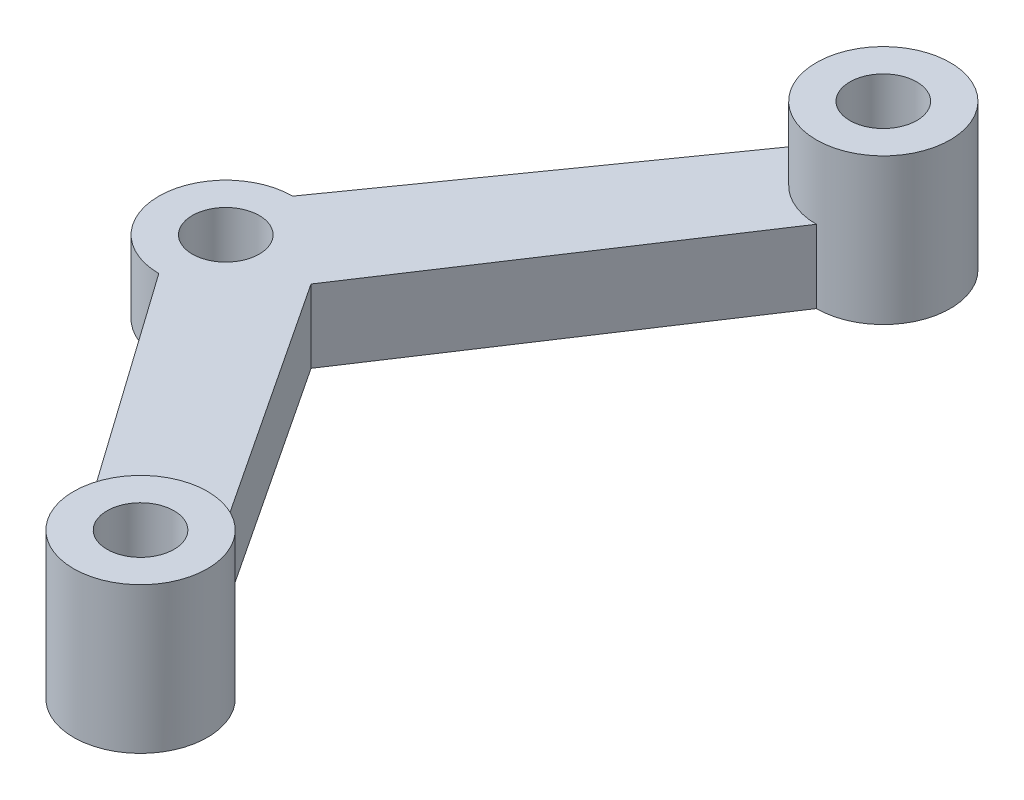
ISO-10303-21;
HEADER;
FILE_DESCRIPTION(('STEP AP214'),'2;1');
FILE_NAME('part.step','',(''),(''),'','','');
FILE_SCHEMA(('AUTOMOTIVE_DESIGN { 1 0 10303 214 1 1 1 1 }'));
ENDSEC;
DATA;
#1=APPLICATION_CONTEXT('core data for automotive mechanical design processes');
#2=APPLICATION_PROTOCOL_DEFINITION('international standard','automotive_design',2000,#1);
#3=PRODUCT_CONTEXT('',#1,'mechanical');
#4=PRODUCT('Part','Part','',(#3));
#5=PRODUCT_RELATED_PRODUCT_CATEGORY('part','',(#4));
#6=PRODUCT_DEFINITION_FORMATION('','',#4);
#7=PRODUCT_DEFINITION_CONTEXT('part definition',#1,'design');
#8=PRODUCT_DEFINITION('design','',#6,#7);
#9=PRODUCT_DEFINITION_SHAPE('','',#8);
#10=(LENGTH_UNIT() NAMED_UNIT(*) SI_UNIT(.MILLI.,.METRE.));
#11=(NAMED_UNIT(*) PLANE_ANGLE_UNIT() SI_UNIT($,.RADIAN.));
#12=(NAMED_UNIT(*) SI_UNIT($,.STERADIAN.) SOLID_ANGLE_UNIT());
#13=UNCERTAINTY_MEASURE_WITH_UNIT(LENGTH_MEASURE(1.E-05),#10,'distance_accuracy_value','');
#14=(GEOMETRIC_REPRESENTATION_CONTEXT(3) GLOBAL_UNCERTAINTY_ASSIGNED_CONTEXT((#13)) GLOBAL_UNIT_ASSIGNED_CONTEXT((#10,
#11,#12)) REPRESENTATION_CONTEXT('',''));
#15=CARTESIAN_POINT('',(0.,0.,0.));
#16=DIRECTION('',(0.,0.,1.));
#17=DIRECTION('',(1.,0.,0.));
#18=AXIS2_PLACEMENT_3D('',#15,#16,#17);
#19=CARTESIAN_POINT('',(-15.25,3.,15.25));
#20=DIRECTION('',(0.,1.,0.));
#21=DIRECTION('',(0.,0.,1.));
#22=AXIS2_PLACEMENT_3D('',#19,#20,#21);
#23=PLANE('',#22);
#24=CARTESIAN_POINT('',(-15.25,3.,-15.25));
#25=DIRECTION('',(0.,1.,0.));
#26=DIRECTION('',(0.,0.,1.));
#27=AXIS2_PLACEMENT_3D('',#24,#25,#26);
#28=CIRCLE('',#27,2.75);
#29=CARTESIAN_POINT('',(-17.9877734334544,3.,-15.5090301663348));
#30=VERTEX_POINT('',#29);
#31=CARTESIAN_POINT('',(-15.25,3.,-12.5));
#32=VERTEX_POINT('',#31);
#33=EDGE_CURVE('E11',#30,#32,#28,.T.);
#34=ORIENTED_EDGE('',*,*,#33,.F.);
#35=DIRECTION('',(-0.57693322372587,0.,0.8167913168988));
#36=VECTOR('',#35,1.);
#37=CARTESIAN_POINT('',(-17.9877734334544,3.,-15.5090301663348));
#38=LINE('',#37,#36);
#39=CARTESIAN_POINT('',(-27.,3.,-2.75));
#40=VERTEX_POINT('',#39);
#41=EDGE_CURVE('E107',#30,#40,#38,.T.);
#42=ORIENTED_EDGE('',*,*,#41,.T.);
#43=CARTESIAN_POINT('',(-27.,3.,0.));
#44=DIRECTION('',(0.,1.,0.));
#45=DIRECTION('',(0.,0.,1.));
#46=AXIS2_PLACEMENT_3D('',#43,#44,#45);
#47=CIRCLE('',#46,2.75);
#48=CARTESIAN_POINT('',(-27.,3.,2.75));
#49=VERTEX_POINT('',#48);
#50=EDGE_CURVE('E111',#40,#49,#47,.T.);
#51=ORIENTED_EDGE('',*,*,#50,.T.);
#52=DIRECTION('',(0.57693322372587,0.,0.8167913168988));
#53=VECTOR('',#52,1.);
#54=CARTESIAN_POINT('',(-27.,3.,2.75));
#55=LINE('',#54,#53);
#56=CARTESIAN_POINT('',(-17.9877734334544,3.,15.5090301663348));
#57=VERTEX_POINT('',#56);
#58=EDGE_CURVE('E59',#49,#57,#55,.T.);
#59=ORIENTED_EDGE('',*,*,#58,.T.);
#60=CARTESIAN_POINT('',(-15.25,3.,15.25));
#61=DIRECTION('',(0.,1.,0.));
#62=DIRECTION('',(0.,0.,1.));
#63=AXIS2_PLACEMENT_3D('',#60,#61,#62);
#64=CIRCLE('',#63,2.75);
#65=CARTESIAN_POINT('',(-15.25,3.,12.5));
#66=VERTEX_POINT('',#65);
#67=EDGE_CURVE('E187',#66,#57,#64,.T.);
#68=ORIENTED_EDGE('',*,*,#67,.F.);
#69=DIRECTION('',(-0.550842208330739,0.,-0.834609406561725));
#70=VECTOR('',#69,1.);
#71=CARTESIAN_POINT('',(-15.25,3.,12.5));
#72=LINE('',#71,#70);
#73=CARTESIAN_POINT('',(-23.5,3.,0.));
#74=VERTEX_POINT('',#73);
#75=EDGE_CURVE('E99',#66,#74,#72,.T.);
#76=ORIENTED_EDGE('',*,*,#75,.T.);
#77=DIRECTION('',(0.550842208330739,0.,-0.834609406561725));
#78=VECTOR('',#77,1.);
#79=CARTESIAN_POINT('',(-15.25,3.,-12.5));
#80=LINE('',#79,#78);
#81=EDGE_CURVE('E115',#74,#32,#80,.T.);
#82=ORIENTED_EDGE('',*,*,#81,.T.);
#83=EDGE_LOOP('',(#34,#42,#51,#59,#68,#76,#82));
#84=FACE_BOUND('',#83,.T.);
#85=CARTESIAN_POINT('',(-27.,3.,0.));
#86=DIRECTION('',(0.,1.,0.));
#87=DIRECTION('',(0.,0.,1.));
#88=AXIS2_PLACEMENT_3D('',#85,#86,#87);
#89=CIRCLE('',#88,1.375);
#90=CARTESIAN_POINT('',(-27.,3.,1.375));
#91=VERTEX_POINT('',#90);
#92=EDGE_CURVE('E194',#91,#91,#89,.T.);
#93=ORIENTED_EDGE('',*,*,#92,.F.);
#94=EDGE_LOOP('',(#93));
#95=FACE_BOUND('',#94,.T.);
#96=ADVANCED_FACE('F41',(#84,#95),#23,.T.);
#97=CARTESIAN_POINT('',(-15.25,0.,15.25));
#98=DIRECTION('',(0.,1.,0.));
#99=DIRECTION('',(0.,0.,1.));
#100=AXIS2_PLACEMENT_3D('',#97,#98,#99);
#101=PLANE('',#100);
#102=CARTESIAN_POINT('',(-15.25,0.,15.25));
#103=DIRECTION('',(0.,1.,0.));
#104=DIRECTION('',(0.,0.,1.));
#105=AXIS2_PLACEMENT_3D('',#102,#103,#104);
#106=CIRCLE('',#105,2.75);
#107=CARTESIAN_POINT('',(-17.9877734334544,0.,15.5090301663348));
#108=VERTEX_POINT('',#107);
#109=CARTESIAN_POINT('',(-15.25,0.,12.5));
#110=VERTEX_POINT('',#109);
#111=EDGE_CURVE('E130',#108,#110,#106,.T.);
#112=ORIENTED_EDGE('',*,*,#111,.F.);
#113=DIRECTION('',(0.57693322372587,0.,0.8167913168988));
#114=VECTOR('',#113,1.);
#115=CARTESIAN_POINT('',(-27.,0.,2.75));
#116=LINE('',#115,#114);
#117=CARTESIAN_POINT('',(-27.,0.,2.75));
#118=VERTEX_POINT('',#117);
#119=EDGE_CURVE('E92',#118,#108,#116,.T.);
#120=ORIENTED_EDGE('',*,*,#119,.F.);
#121=CARTESIAN_POINT('',(-27.,0.,0.));
#122=DIRECTION('',(0.,1.,0.));
#123=DIRECTION('',(0.,0.,1.));
#124=AXIS2_PLACEMENT_3D('',#121,#122,#123);
#125=CIRCLE('',#124,2.75);
#126=CARTESIAN_POINT('',(-27.,0.,-2.75));
#127=VERTEX_POINT('',#126);
#128=EDGE_CURVE('E86',#127,#118,#125,.T.);
#129=ORIENTED_EDGE('',*,*,#128,.F.);
#130=DIRECTION('',(-0.57693322372587,0.,0.8167913168988));
#131=VECTOR('',#130,1.);
#132=CARTESIAN_POINT('',(-17.9877734334544,0.,-15.5090301663348));
#133=LINE('',#132,#131);
#134=CARTESIAN_POINT('',(-17.9877734334544,0.,-15.5090301663348));
#135=VERTEX_POINT('',#134);
#136=EDGE_CURVE('E120',#135,#127,#133,.T.);
#137=ORIENTED_EDGE('',*,*,#136,.F.);
#138=CARTESIAN_POINT('',(-15.25,0.,-15.25));
#139=DIRECTION('',(0.,1.,0.));
#140=DIRECTION('',(0.,0.,1.));
#141=AXIS2_PLACEMENT_3D('',#138,#139,#140);
#142=CIRCLE('',#141,2.75);
#143=CARTESIAN_POINT('',(-15.25,0.,-12.5));
#144=VERTEX_POINT('',#143);
#145=EDGE_CURVE('E138',#144,#135,#142,.T.);
#146=ORIENTED_EDGE('',*,*,#145,.F.);
#147=DIRECTION('',(0.550842208330739,0.,-0.834609406561725));
#148=VECTOR('',#147,1.);
#149=CARTESIAN_POINT('',(-15.25,0.,-12.5));
#150=LINE('',#149,#148);
#151=CARTESIAN_POINT('',(-23.5,0.,0.));
#152=VERTEX_POINT('',#151);
#153=EDGE_CURVE('E136',#152,#144,#150,.T.);
#154=ORIENTED_EDGE('',*,*,#153,.F.);
#155=DIRECTION('',(-0.550842208330739,0.,-0.834609406561725));
#156=VECTOR('',#155,1.);
#157=CARTESIAN_POINT('',(-15.25,0.,12.5));
#158=LINE('',#157,#156);
#159=EDGE_CURVE('E133',#110,#152,#158,.T.);
#160=ORIENTED_EDGE('',*,*,#159,.F.);
#161=EDGE_LOOP('',(#112,#120,#129,#137,#146,#154,#160));
#162=FACE_BOUND('',#161,.T.);
#163=CARTESIAN_POINT('',(-15.25,0.,-15.25));
#164=DIRECTION('',(0.,1.,0.));
#165=DIRECTION('',(0.,0.,1.));
#166=AXIS2_PLACEMENT_3D('',#163,#164,#165);
#167=CIRCLE('',#166,1.375);
#168=CARTESIAN_POINT('',(-15.25,0.,-13.875));
#169=VERTEX_POINT('',#168);
#170=EDGE_CURVE('E134',#169,#169,#167,.T.);
#171=ORIENTED_EDGE('',*,*,#170,.T.);
#172=EDGE_LOOP('',(#171));
#173=FACE_BOUND('',#172,.T.);
#174=CARTESIAN_POINT('',(-27.,0.,0.));
#175=DIRECTION('',(0.,1.,0.));
#176=DIRECTION('',(0.,0.,1.));
#177=AXIS2_PLACEMENT_3D('',#174,#175,#176);
#178=CIRCLE('',#177,1.375);
#179=CARTESIAN_POINT('',(-27.,0.,1.375));
#180=VERTEX_POINT('',#179);
#181=EDGE_CURVE('E181',#180,#180,#178,.T.);
#182=ORIENTED_EDGE('',*,*,#181,.T.);
#183=EDGE_LOOP('',(#182));
#184=FACE_BOUND('',#183,.T.);
#185=CARTESIAN_POINT('',(-15.25,0.,15.25));
#186=DIRECTION('',(0.,1.,0.));
#187=DIRECTION('',(0.,0.,1.));
#188=AXIS2_PLACEMENT_3D('',#185,#186,#187);
#189=CIRCLE('',#188,1.375);
#190=CARTESIAN_POINT('',(-15.25,0.,16.625));
#191=VERTEX_POINT('',#190);
#192=EDGE_CURVE('E177',#191,#191,#189,.T.);
#193=ORIENTED_EDGE('',*,*,#192,.T.);
#194=EDGE_LOOP('',(#193));
#195=FACE_BOUND('',#194,.T.);
#196=ADVANCED_FACE('F163',(#162,#173,#184,#195),#101,.F.);
#197=CARTESIAN_POINT('',(-15.25,3.,15.25));
#198=DIRECTION('',(0.,-1.,0.));
#199=DIRECTION('',(0.,0.,-1.));
#200=AXIS2_PLACEMENT_3D('',#197,#198,#199);
#201=CYLINDRICAL_SURFACE('',#200,2.75);
#202=ORIENTED_EDGE('',*,*,#111,.T.);
#203=DIRECTION('',(0.,-1.,0.));
#204=VECTOR('',#203,1.);
#205=CARTESIAN_POINT('',(-15.25,3.,12.5));
#206=LINE('',#205,#204);
#207=EDGE_CURVE('E45',#66,#110,#206,.T.);
#208=ORIENTED_EDGE('',*,*,#207,.F.);
#209=ORIENTED_EDGE('',*,*,#67,.T.);
#210=DIRECTION('',(0.,-1.,0.));
#211=VECTOR('',#210,1.);
#212=CARTESIAN_POINT('',(-17.9877734334544,3.,15.5090301663348));
#213=LINE('',#212,#211);
#214=EDGE_CURVE('E126',#57,#108,#213,.T.);
#215=ORIENTED_EDGE('',*,*,#214,.T.);
#216=EDGE_LOOP('',(#202,#208,#209,#215));
#217=FACE_BOUND('',#216,.T.);
#218=CARTESIAN_POINT('',(-15.25,6.,15.25));
#219=DIRECTION('',(0.,1.,0.));
#220=DIRECTION('',(0.,0.,1.));
#221=AXIS2_PLACEMENT_3D('',#218,#219,#220);
#222=CIRCLE('',#221,2.75);
#223=CARTESIAN_POINT('',(-15.25,6.,18.));
#224=VERTEX_POINT('',#223);
#225=EDGE_CURVE('E189',#224,#224,#222,.T.);
#226=ORIENTED_EDGE('',*,*,#225,.F.);
#227=EDGE_LOOP('',(#226));
#228=FACE_BOUND('',#227,.T.);
#229=ADVANCED_FACE('F43',(#217,#228),#201,.T.);
#230=CARTESIAN_POINT('',(-15.25,3.,12.5));
#231=DIRECTION('',(-0.834609406561725,0.,0.550842208330739));
#232=DIRECTION('',(0.550842208330739,0.,0.834609406561725));
#233=AXIS2_PLACEMENT_3D('',#230,#231,#232);
#234=PLANE('',#233);
#235=ORIENTED_EDGE('',*,*,#159,.T.);
#236=DIRECTION('',(0.,-1.,0.));
#237=VECTOR('',#236,1.);
#238=CARTESIAN_POINT('',(-23.5,3.,0.));
#239=LINE('',#238,#237);
#240=EDGE_CURVE('E148',#74,#152,#239,.T.);
#241=ORIENTED_EDGE('',*,*,#240,.F.);
#242=ORIENTED_EDGE('',*,*,#75,.F.);
#243=ORIENTED_EDGE('',*,*,#207,.T.);
#244=EDGE_LOOP('',(#235,#241,#242,#243));
#245=FACE_BOUND('',#244,.T.);
#246=ADVANCED_FACE('F156',(#245),#234,.F.);
#247=CARTESIAN_POINT('',(-15.25,3.,-12.5));
#248=DIRECTION('',(-0.834609406561725,0.,-0.550842208330739));
#249=DIRECTION('',(-0.550842208330739,0.,0.834609406561725));
#250=AXIS2_PLACEMENT_3D('',#247,#248,#249);
#251=PLANE('',#250);
#252=ORIENTED_EDGE('',*,*,#153,.T.);
#253=DIRECTION('',(0.,-1.,0.));
#254=VECTOR('',#253,1.);
#255=CARTESIAN_POINT('',(-15.25,3.,-12.5));
#256=LINE('',#255,#254);
#257=EDGE_CURVE('E146',#32,#144,#256,.T.);
#258=ORIENTED_EDGE('',*,*,#257,.F.);
#259=ORIENTED_EDGE('',*,*,#81,.F.);
#260=ORIENTED_EDGE('',*,*,#240,.T.);
#261=EDGE_LOOP('',(#252,#258,#259,#260));
#262=FACE_BOUND('',#261,.T.);
#263=ADVANCED_FACE('F167',(#262),#251,.F.);
#264=CARTESIAN_POINT('',(-15.25,3.,-15.25));
#265=DIRECTION('',(0.,-1.,0.));
#266=DIRECTION('',(0.,0.,-1.));
#267=AXIS2_PLACEMENT_3D('',#264,#265,#266);
#268=CYLINDRICAL_SURFACE('',#267,2.75);
#269=ORIENTED_EDGE('',*,*,#145,.T.);
#270=DIRECTION('',(0.,-1.,0.));
#271=VECTOR('',#270,1.);
#272=CARTESIAN_POINT('',(-17.9877734334544,3.,-15.5090301663348));
#273=LINE('',#272,#271);
#274=EDGE_CURVE('E121',#30,#135,#273,.T.);
#275=ORIENTED_EDGE('',*,*,#274,.F.);
#276=ORIENTED_EDGE('',*,*,#33,.T.);
#277=ORIENTED_EDGE('',*,*,#257,.T.);
#278=EDGE_LOOP('',(#269,#275,#276,#277));
#279=FACE_BOUND('',#278,.T.);
#280=CARTESIAN_POINT('',(-15.25,6.,-15.25));
#281=DIRECTION('',(0.,1.,0.));
#282=DIRECTION('',(0.,0.,1.));
#283=AXIS2_PLACEMENT_3D('',#280,#281,#282);
#284=CIRCLE('',#283,2.75);
#285=CARTESIAN_POINT('',(-15.25,6.,-12.5));
#286=VERTEX_POINT('',#285);
#287=EDGE_CURVE('E175',#286,#286,#284,.T.);
#288=ORIENTED_EDGE('',*,*,#287,.F.);
#289=EDGE_LOOP('',(#288));
#290=FACE_BOUND('',#289,.T.);
#291=ADVANCED_FACE('F169',(#279,#290),#268,.T.);
#292=CARTESIAN_POINT('',(-17.9877734334544,3.,-15.5090301663348));
#293=DIRECTION('',(0.8167913168988,0.,0.57693322372587));
#294=DIRECTION('',(0.57693322372587,0.,-0.8167913168988));
#295=AXIS2_PLACEMENT_3D('',#292,#293,#294);
#296=PLANE('',#295);
#297=ORIENTED_EDGE('',*,*,#136,.T.);
#298=DIRECTION('',(0.,-1.,0.));
#299=VECTOR('',#298,1.);
#300=CARTESIAN_POINT('',(-27.,3.,-2.75));
#301=LINE('',#300,#299);
#302=EDGE_CURVE('E117',#40,#127,#301,.T.);
#303=ORIENTED_EDGE('',*,*,#302,.F.);
#304=ORIENTED_EDGE('',*,*,#41,.F.);
#305=ORIENTED_EDGE('',*,*,#274,.T.);
#306=EDGE_LOOP('',(#297,#303,#304,#305));
#307=FACE_BOUND('',#306,.T.);
#308=ADVANCED_FACE('F118',(#307),#296,.F.);
#309=CARTESIAN_POINT('',(-27.,3.,0.));
#310=DIRECTION('',(0.,-1.,0.));
#311=DIRECTION('',(0.,0.,-1.));
#312=AXIS2_PLACEMENT_3D('',#309,#310,#311);
#313=CYLINDRICAL_SURFACE('',#312,2.75);
#314=ORIENTED_EDGE('',*,*,#128,.T.);
#315=DIRECTION('',(0.,-1.,0.));
#316=VECTOR('',#315,1.);
#317=CARTESIAN_POINT('',(-27.,3.,2.75));
#318=LINE('',#317,#316);
#319=EDGE_CURVE('E122',#49,#118,#318,.T.);
#320=ORIENTED_EDGE('',*,*,#319,.F.);
#321=ORIENTED_EDGE('',*,*,#50,.F.);
#322=ORIENTED_EDGE('',*,*,#302,.T.);
#323=EDGE_LOOP('',(#314,#320,#321,#322));
#324=FACE_BOUND('',#323,.T.);
#325=ADVANCED_FACE('F124',(#324),#313,.T.);
#326=CARTESIAN_POINT('',(-27.,3.,2.75));
#327=DIRECTION('',(0.8167913168988,0.,-0.57693322372587));
#328=DIRECTION('',(-0.57693322372587,0.,-0.8167913168988));
#329=AXIS2_PLACEMENT_3D('',#326,#327,#328);
#330=PLANE('',#329);
#331=ORIENTED_EDGE('',*,*,#119,.T.);
#332=ORIENTED_EDGE('',*,*,#214,.F.);
#333=ORIENTED_EDGE('',*,*,#58,.F.);
#334=ORIENTED_EDGE('',*,*,#319,.T.);
#335=EDGE_LOOP('',(#331,#332,#333,#334));
#336=FACE_BOUND('',#335,.T.);
#337=ADVANCED_FACE('F208',(#336),#330,.F.);
#338=CARTESIAN_POINT('',(-15.25,3.,-15.25));
#339=DIRECTION('',(0.,-1.,0.));
#340=DIRECTION('',(0.,0.,-1.));
#341=AXIS2_PLACEMENT_3D('',#338,#339,#340);
#342=CYLINDRICAL_SURFACE('',#341,1.375);
#343=ORIENTED_EDGE('',*,*,#170,.F.);
#344=EDGE_LOOP('',(#343));
#345=FACE_BOUND('',#344,.T.);
#346=CARTESIAN_POINT('',(-15.25,6.,-15.25));
#347=DIRECTION('',(0.,1.,0.));
#348=DIRECTION('',(0.,0.,1.));
#349=AXIS2_PLACEMENT_3D('',#346,#347,#348);
#350=CIRCLE('',#349,1.375);
#351=CARTESIAN_POINT('',(-15.25,6.,-13.875));
#352=VERTEX_POINT('',#351);
#353=EDGE_CURVE('E178',#352,#352,#350,.T.);
#354=ORIENTED_EDGE('',*,*,#353,.T.);
#355=EDGE_LOOP('',(#354));
#356=FACE_BOUND('',#355,.T.);
#357=ADVANCED_FACE('F204',(#345,#356),#342,.F.);
#358=CARTESIAN_POINT('',(-27.,3.,0.));
#359=DIRECTION('',(0.,-1.,0.));
#360=DIRECTION('',(0.,0.,-1.));
#361=AXIS2_PLACEMENT_3D('',#358,#359,#360);
#362=CYLINDRICAL_SURFACE('',#361,1.375);
#363=ORIENTED_EDGE('',*,*,#92,.T.);
#364=EDGE_LOOP('',(#363));
#365=FACE_BOUND('',#364,.T.);
#366=ORIENTED_EDGE('',*,*,#181,.F.);
#367=EDGE_LOOP('',(#366));
#368=FACE_BOUND('',#367,.T.);
#369=ADVANCED_FACE('F207',(#365,#368),#362,.F.);
#370=CARTESIAN_POINT('',(-15.25,3.,15.25));
#371=DIRECTION('',(0.,-1.,0.));
#372=DIRECTION('',(0.,0.,-1.));
#373=AXIS2_PLACEMENT_3D('',#370,#371,#372);
#374=CYLINDRICAL_SURFACE('',#373,1.375);
#375=ORIENTED_EDGE('',*,*,#192,.F.);
#376=EDGE_LOOP('',(#375));
#377=FACE_BOUND('',#376,.T.);
#378=CARTESIAN_POINT('',(-15.25,6.,15.25));
#379=DIRECTION('',(0.,1.,0.));
#380=DIRECTION('',(0.,0.,1.));
#381=AXIS2_PLACEMENT_3D('',#378,#379,#380);
#382=CIRCLE('',#381,1.375);
#383=CARTESIAN_POINT('',(-15.25,6.,16.625));
#384=VERTEX_POINT('',#383);
#385=EDGE_CURVE('E184',#384,#384,#382,.T.);
#386=ORIENTED_EDGE('',*,*,#385,.T.);
#387=EDGE_LOOP('',(#386));
#388=FACE_BOUND('',#387,.T.);
#389=ADVANCED_FACE('F219',(#377,#388),#374,.F.);
#390=CARTESIAN_POINT('',(-15.25,6.,15.25));
#391=DIRECTION('',(0.,1.,0.));
#392=DIRECTION('',(0.,0.,1.));
#393=AXIS2_PLACEMENT_3D('',#390,#391,#392);
#394=PLANE('',#393);
#395=ORIENTED_EDGE('',*,*,#225,.T.);
#396=EDGE_LOOP('',(#395));
#397=FACE_BOUND('',#396,.T.);
#398=ORIENTED_EDGE('',*,*,#385,.F.);
#399=EDGE_LOOP('',(#398));
#400=FACE_BOUND('',#399,.T.);
#401=ADVANCED_FACE('F214',(#397,#400),#394,.T.);
#402=CARTESIAN_POINT('',(-15.25,6.,-15.25));
#403=DIRECTION('',(0.,1.,0.));
#404=DIRECTION('',(0.,0.,1.));
#405=AXIS2_PLACEMENT_3D('',#402,#403,#404);
#406=PLANE('',#405);
#407=ORIENTED_EDGE('',*,*,#287,.T.);
#408=EDGE_LOOP('',(#407));
#409=FACE_BOUND('',#408,.T.);
#410=ORIENTED_EDGE('',*,*,#353,.F.);
#411=EDGE_LOOP('',(#410));
#412=FACE_BOUND('',#411,.T.);
#413=ADVANCED_FACE('F212',(#409,#412),#406,.T.);
#414=CLOSED_SHELL('',(#96,#196,#229,#246,#263,#291,#308,#325,#337,#357,#369,#389,#401,#413));
#415=MANIFOLD_SOLID_BREP('B2',#414);
#416=ADVANCED_BREP_SHAPE_REPRESENTATION('',(#18,#415),#14);
#417=SHAPE_DEFINITION_REPRESENTATION(#9,#416);
ENDSEC;
END-ISO-10303-21;
